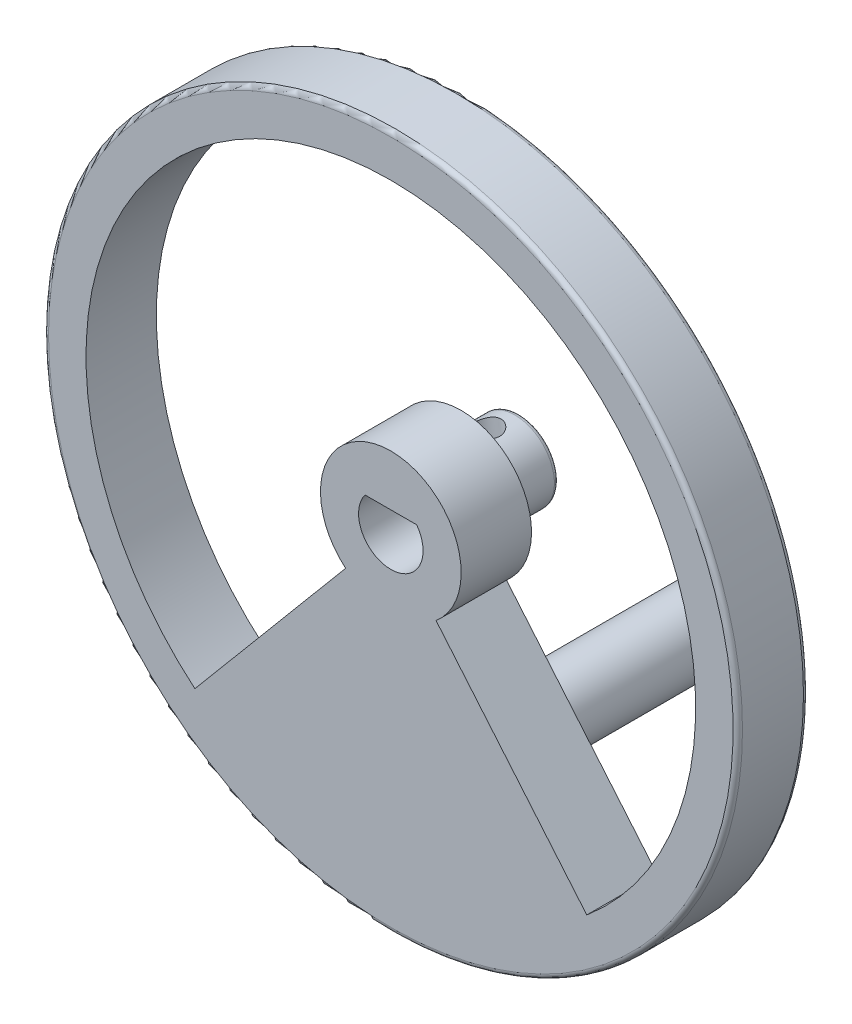
ISO-10303-21;
HEADER;
FILE_DESCRIPTION(('STEP AP214'),'2;1');
FILE_NAME('part.step','',(''),(''),'','','');
FILE_SCHEMA(('AUTOMOTIVE_DESIGN { 1 0 10303 214 1 1 1 1 }'));
ENDSEC;
DATA;
#1=APPLICATION_CONTEXT('core data for automotive mechanical design processes');
#2=APPLICATION_PROTOCOL_DEFINITION('international standard','automotive_design',2000,#1);
#3=PRODUCT_CONTEXT('',#1,'mechanical');
#4=PRODUCT('Part','Part','',(#3));
#5=PRODUCT_RELATED_PRODUCT_CATEGORY('part','',(#4));
#6=PRODUCT_DEFINITION_FORMATION('','',#4);
#7=PRODUCT_DEFINITION_CONTEXT('part definition',#1,'design');
#8=PRODUCT_DEFINITION('design','',#6,#7);
#9=PRODUCT_DEFINITION_SHAPE('','',#8);
#10=(LENGTH_UNIT() NAMED_UNIT(*) SI_UNIT(.MILLI.,.METRE.));
#11=(NAMED_UNIT(*) PLANE_ANGLE_UNIT() SI_UNIT($,.RADIAN.));
#12=(NAMED_UNIT(*) SI_UNIT($,.STERADIAN.) SOLID_ANGLE_UNIT());
#13=UNCERTAINTY_MEASURE_WITH_UNIT(LENGTH_MEASURE(1.E-05),#10,'distance_accuracy_value','');
#14=(GEOMETRIC_REPRESENTATION_CONTEXT(3) GLOBAL_UNCERTAINTY_ASSIGNED_CONTEXT((#13)) GLOBAL_UNIT_ASSIGNED_CONTEXT((#10,
#11,#12)) REPRESENTATION_CONTEXT('',''));
#15=CARTESIAN_POINT('',(0.,0.,0.));
#16=DIRECTION('',(0.,0.,1.));
#17=DIRECTION('',(1.,0.,0.));
#18=AXIS2_PLACEMENT_3D('',#15,#16,#17);
#19=CARTESIAN_POINT('',(0.,-2.,-1.));
#20=DIRECTION('',(0.,0.,-1.));
#21=DIRECTION('',(-1.,0.,0.));
#22=AXIS2_PLACEMENT_3D('',#19,#20,#21);
#23=PLANE('',#22);
#24=CARTESIAN_POINT('',(0.,-2.,-1.));
#25=DIRECTION('',(0.,0.,1.));
#26=DIRECTION('',(-1.,0.,0.));
#27=AXIS2_PLACEMENT_3D('',#24,#25,#26);
#28=CIRCLE('',#27,3.);
#29=CARTESIAN_POINT('',(1.92836282905961,-4.29813332935694,-1.));
#30=VERTEX_POINT('',#29);
#31=CARTESIAN_POINT('',(-1.92836282905961,-4.29813332935694,-1.));
#32=VERTEX_POINT('',#31);
#33=EDGE_CURVE('E59',#30,#32,#28,.T.);
#34=ORIENTED_EDGE('',*,*,#33,.F.);
#35=DIRECTION('',(-0.642787609686538,0.766044443118979,0.));
#36=VECTOR('',#35,1.);
#37=CARTESIAN_POINT('',(1.92836282905961,-4.29813332935694,-1.));
#38=LINE('',#37,#36);
#39=CARTESIAN_POINT('',(8.35623892592499,-11.9585777605467,-1.));
#40=VERTEX_POINT('',#39);
#41=EDGE_CURVE('E321',#40,#30,#38,.T.);
#42=ORIENTED_EDGE('',*,*,#41,.F.);
#43=CARTESIAN_POINT('',(0.,-2.,-1.));
#44=DIRECTION('',(0.,0.,-1.));
#45=DIRECTION('',(-1.,0.,0.));
#46=AXIS2_PLACEMENT_3D('',#43,#44,#45);
#47=CIRCLE('',#46,13.);
#48=CARTESIAN_POINT('',(-8.35623892592499,-11.9585777605467,-1.));
#49=VERTEX_POINT('',#48);
#50=EDGE_CURVE('E328',#49,#40,#47,.T.);
#51=ORIENTED_EDGE('',*,*,#50,.F.);
#52=DIRECTION('',(-0.642787609686538,-0.766044443118979,0.));
#53=VECTOR('',#52,1.);
#54=CARTESIAN_POINT('',(-1.92836282905961,-4.29813332935694,-1.));
#55=LINE('',#54,#53);
#56=EDGE_CURVE('E331',#32,#49,#55,.T.);
#57=ORIENTED_EDGE('',*,*,#56,.F.);
#58=EDGE_LOOP('',(#34,#42,#51,#57));
#59=FACE_BOUND('',#58,.T.);
#60=CARTESIAN_POINT('',(0.,-2.,-1.));
#61=DIRECTION('',(0.,0.,-1.));
#62=DIRECTION('',(-1.,0.,0.));
#63=AXIS2_PLACEMENT_3D('',#60,#61,#62);
#64=CIRCLE('',#63,14.5982201502927);
#65=CARTESIAN_POINT('',(-14.5982201502927,-2.,-1.));
#66=VERTEX_POINT('',#65);
#67=EDGE_CURVE('E274',#66,#66,#64,.T.);
#68=ORIENTED_EDGE('',*,*,#67,.T.);
#69=EDGE_LOOP('',(#68));
#70=FACE_BOUND('',#69,.T.);
#71=CARTESIAN_POINT('',(0.,-2.,-1.));
#72=DIRECTION('',(0.,0.,-1.));
#73=DIRECTION('',(-1.,0.,0.));
#74=AXIS2_PLACEMENT_3D('',#71,#72,#73);
#75=CIRCLE('',#74,1.675);
#76=CARTESIAN_POINT('',(-1.675,-2.,-1.));
#77=VERTEX_POINT('',#76);
#78=EDGE_CURVE('E268',#77,#77,#75,.T.);
#79=ORIENTED_EDGE('',*,*,#78,.F.);
#80=EDGE_LOOP('',(#79));
#81=FACE_BOUND('',#80,.T.);
#82=CARTESIAN_POINT('',(0.,-12.,-1.));
#83=DIRECTION('',(0.,0.,-1.));
#84=DIRECTION('',(-1.,0.,0.));
#85=AXIS2_PLACEMENT_3D('',#82,#83,#84);
#86=CIRCLE('',#85,2.);
#87=CARTESIAN_POINT('',(-2.,-12.,-1.));
#88=VERTEX_POINT('',#87);
#89=EDGE_CURVE('E253',#88,#88,#86,.T.);
#90=ORIENTED_EDGE('',*,*,#89,.F.);
#91=EDGE_LOOP('',(#90));
#92=FACE_BOUND('',#91,.T.);
#93=ADVANCED_FACE('F37',(#59,#70,#81,#92),#23,.T.);
#94=CARTESIAN_POINT('',(0.,-2.,-1.));
#95=DIRECTION('',(0.,0.,1.));
#96=DIRECTION('',(1.,0.,0.));
#97=AXIS2_PLACEMENT_3D('',#94,#95,#96);
#98=CYLINDRICAL_SURFACE('',#97,14.7982201502927);
#99=CARTESIAN_POINT('',(0.,-2.,1.8));
#100=DIRECTION('',(0.,0.,-1.));
#101=DIRECTION('',(-1.,0.,0.));
#102=AXIS2_PLACEMENT_3D('',#99,#100,#101);
#103=CIRCLE('',#102,14.7982201502927);
#104=CARTESIAN_POINT('',(-14.7982201502927,-2.,1.8));
#105=VERTEX_POINT('',#104);
#106=EDGE_CURVE('E281',#105,#105,#103,.T.);
#107=ORIENTED_EDGE('',*,*,#106,.T.);
#108=EDGE_LOOP('',(#107));
#109=FACE_BOUND('',#108,.T.);
#110=CARTESIAN_POINT('',(0.,-2.,-0.8));
#111=DIRECTION('',(0.,0.,-1.));
#112=DIRECTION('',(-1.,0.,0.));
#113=AXIS2_PLACEMENT_3D('',#110,#111,#112);
#114=CIRCLE('',#113,14.7982201502927);
#115=CARTESIAN_POINT('',(-14.7982201502927,-2.,-0.8));
#116=VERTEX_POINT('',#115);
#117=EDGE_CURVE('E278',#116,#116,#114,.F.);
#118=ORIENTED_EDGE('',*,*,#117,.T.);
#119=EDGE_LOOP('',(#118));
#120=FACE_BOUND('',#119,.T.);
#121=ADVANCED_FACE('F207',(#109,#120),#98,.T.);
#122=CARTESIAN_POINT('',(0.,-2.,2.));
#123=DIRECTION('',(0.,0.,-1.));
#124=DIRECTION('',(-1.,0.,0.));
#125=AXIS2_PLACEMENT_3D('',#122,#123,#124);
#126=PLANE('',#125);
#127=DIRECTION('',(0.642787609686538,-0.766044443118979,0.));
#128=VECTOR('',#127,1.);
#129=CARTESIAN_POINT('',(1.92836282905961,-4.29813332935694,2.));
#130=LINE('',#129,#128);
#131=CARTESIAN_POINT('',(1.92836282905961,-4.29813332935694,2.));
#132=VERTEX_POINT('',#131);
#133=CARTESIAN_POINT('',(8.35623892592499,-11.9585777605467,2.));
#134=VERTEX_POINT('',#133);
#135=EDGE_CURVE('E338',#132,#134,#130,.T.);
#136=ORIENTED_EDGE('',*,*,#135,.F.);
#137=CARTESIAN_POINT('',(0.,-2.,2.));
#138=DIRECTION('',(0.,0.,-1.));
#139=DIRECTION('',(-1.,0.,0.));
#140=AXIS2_PLACEMENT_3D('',#137,#138,#139);
#141=CIRCLE('',#140,3.);
#142=CARTESIAN_POINT('',(-1.92836282905961,-4.29813332935694,2.));
#143=VERTEX_POINT('',#142);
#144=EDGE_CURVE('E335',#143,#132,#141,.T.);
#145=ORIENTED_EDGE('',*,*,#144,.F.);
#146=DIRECTION('',(0.642787609686538,0.766044443118979,0.));
#147=VECTOR('',#146,1.);
#148=CARTESIAN_POINT('',(-1.92836282905961,-4.29813332935694,2.));
#149=LINE('',#148,#147);
#150=CARTESIAN_POINT('',(-8.35623892592499,-11.9585777605467,2.));
#151=VERTEX_POINT('',#150);
#152=EDGE_CURVE('E314',#151,#143,#149,.T.);
#153=ORIENTED_EDGE('',*,*,#152,.F.);
#154=CARTESIAN_POINT('',(0.,-2.,2.));
#155=DIRECTION('',(0.,0.,-1.));
#156=DIRECTION('',(-1.,0.,0.));
#157=AXIS2_PLACEMENT_3D('',#154,#155,#156);
#158=CIRCLE('',#157,13.);
#159=EDGE_CURVE('E341',#134,#151,#158,.F.);
#160=ORIENTED_EDGE('',*,*,#159,.F.);
#161=EDGE_LOOP('',(#136,#145,#153,#160));
#162=FACE_BOUND('',#161,.T.);
#163=DIRECTION('',(1.,0.,0.));
#164=VECTOR('',#163,1.);
#165=CARTESIAN_POINT('',(0.,-1.175,2.));
#166=LINE('',#165,#164);
#167=CARTESIAN_POINT('',(-1.1,-1.175,2.));
#168=VERTEX_POINT('',#167);
#169=CARTESIAN_POINT('',(1.1,-1.175,2.));
#170=VERTEX_POINT('',#169);
#171=EDGE_CURVE('E125',#168,#170,#166,.T.);
#172=ORIENTED_EDGE('',*,*,#171,.T.);
#173=CARTESIAN_POINT('',(0.,-2.,2.));
#174=DIRECTION('',(0.,0.,-1.));
#175=DIRECTION('',(-1.,0.,0.));
#176=AXIS2_PLACEMENT_3D('',#173,#174,#175);
#177=CIRCLE('',#176,1.375);
#178=EDGE_CURVE('E129',#170,#168,#177,.T.);
#179=ORIENTED_EDGE('',*,*,#178,.T.);
#180=EDGE_LOOP('',(#172,#179));
#181=FACE_BOUND('',#180,.T.);
#182=CARTESIAN_POINT('',(0.,-2.,2.));
#183=DIRECTION('',(0.,0.,-1.));
#184=DIRECTION('',(-1.,0.,0.));
#185=AXIS2_PLACEMENT_3D('',#182,#183,#184);
#186=CIRCLE('',#185,14.5982201502927);
#187=CARTESIAN_POINT('',(-14.5982201502927,-2.,2.));
#188=VERTEX_POINT('',#187);
#189=EDGE_CURVE('E132',#188,#188,#186,.F.);
#190=ORIENTED_EDGE('',*,*,#189,.T.);
#191=EDGE_LOOP('',(#190));
#192=FACE_BOUND('',#191,.T.);
#193=ADVANCED_FACE('F209',(#162,#181,#192),#126,.F.);
#194=CARTESIAN_POINT('',(0.,-2.,-0.8));
#195=DIRECTION('',(0.,0.,-1.));
#196=DIRECTION('',(-1.,0.,0.));
#197=AXIS2_PLACEMENT_3D('',#194,#195,#196);
#198=TOROIDAL_SURFACE('',#197,14.5982201502927,0.2);
#199=ORIENTED_EDGE('',*,*,#117,.F.);
#200=EDGE_LOOP('',(#199));
#201=FACE_BOUND('',#200,.T.);
#202=ORIENTED_EDGE('',*,*,#67,.F.);
#203=EDGE_LOOP('',(#202));
#204=FACE_BOUND('',#203,.T.);
#205=ADVANCED_FACE('F212',(#201,#204),#198,.T.);
#206=CARTESIAN_POINT('',(0.,-2.,1.8));
#207=DIRECTION('',(0.,0.,-1.));
#208=DIRECTION('',(-1.,0.,0.));
#209=AXIS2_PLACEMENT_3D('',#206,#207,#208);
#210=TOROIDAL_SURFACE('',#209,14.5982201502927,0.2);
#211=ORIENTED_EDGE('',*,*,#189,.F.);
#212=EDGE_LOOP('',(#211));
#213=FACE_BOUND('',#212,.T.);
#214=ORIENTED_EDGE('',*,*,#106,.F.);
#215=EDGE_LOOP('',(#214));
#216=FACE_BOUND('',#215,.T.);
#217=ADVANCED_FACE('F195',(#213,#216),#210,.T.);
#218=CARTESIAN_POINT('',(0.,-2.,2.5));
#219=DIRECTION('',(0.,0.,-1.));
#220=DIRECTION('',(-1.,0.,0.));
#221=AXIS2_PLACEMENT_3D('',#218,#219,#220);
#222=CYLINDRICAL_SURFACE('',#221,1.375);
#223=CARTESIAN_POINT('',(0.786367633467589,-3.12794102019325,-2.24441223535997));
#224=CARTESIAN_POINT('',(0.786364048983087,-3.12794593504006,-2.21140102057159));
#225=CARTESIAN_POINT('',(0.783945436582444,-3.12964194847358,-2.17835044672341));
#226=CARTESIAN_POINT('',(0.774357814028464,-3.13623337166596,-2.11322294213821));
#227=CARTESIAN_POINT('',(0.76717710388292,-3.14113666097013,-2.08114861344341));
#228=CARTESIAN_POINT('',(0.748372079447081,-3.15355518873635,-2.0190424671743));
#229=CARTESIAN_POINT('',(0.736768226295408,-3.16105838588867,-1.98900198368062));
#230=CARTESIAN_POINT('',(0.70944186422138,-3.17795345172177,-1.93145482342112));
#231=CARTESIAN_POINT('',(0.693719791512772,-3.18734512034573,-1.90394787871237));
#232=CARTESIAN_POINT('',(0.657275376610338,-3.20792392841384,-1.85018862739198));
#233=CARTESIAN_POINT('',(0.636286992907342,-3.21918950011451,-1.82414660859055));
#234=CARTESIAN_POINT('',(0.590332408826737,-3.24209163846734,-1.77601810890594));
#235=CARTESIAN_POINT('',(0.565364503803998,-3.25372836238773,-1.75393333177508));
#236=CARTESIAN_POINT('',(0.510431947533978,-3.27711423461864,-1.71319944906709));
#237=CARTESIAN_POINT('',(0.480271757449288,-3.28883624716607,-1.69479656091457));
#238=CARTESIAN_POINT('',(0.416663319550979,-3.3107805458754,-1.66364098832396));
#239=CARTESIAN_POINT('',(0.383216806914694,-3.3210036164469,-1.65088534152562));
#240=CARTESIAN_POINT('',(0.316076979882071,-3.3386002806524,-1.63217865163233));
#241=CARTESIAN_POINT('',(0.282521230173143,-3.3461089276737,-1.62586236097416));
#242=CARTESIAN_POINT('',(0.214374605469172,-3.35862664731924,-1.61902361525765));
#243=CARTESIAN_POINT('',(0.179784244843486,-3.36363694083476,-1.61849832760705));
#244=CARTESIAN_POINT('',(0.113227694157038,-3.37070940724967,-1.62308674207041));
#245=CARTESIAN_POINT('',(0.0812523011027979,-3.37295826788385,-1.62779616918021));
#246=CARTESIAN_POINT('',(0.018310627768156,-3.37523881808645,-1.64201420195062));
#247=CARTESIAN_POINT('',(-0.012655577504552,-3.37527034322577,-1.65152316347366));
#248=CARTESIAN_POINT('',(-0.0732350264513509,-3.37338806397897,-1.67516724330639));
#249=CARTESIAN_POINT('',(-0.102820708830124,-3.3714448175869,-1.68937018296095));
#250=CARTESIAN_POINT('',(-0.159458774086087,-3.36601924131324,-1.72192356878679));
#251=CARTESIAN_POINT('',(-0.186510223942216,-3.36253634726182,-1.74027553407129));
#252=CARTESIAN_POINT('',(-0.239601823380074,-3.35425090232414,-1.78233711318197));
#253=CARTESIAN_POINT('',(-0.265379681783792,-3.34936390762842,-1.80636155892853));
#254=CARTESIAN_POINT('',(-0.312699238263193,-3.339190492857,-1.8582207968663));
#255=CARTESIAN_POINT('',(-0.33423863683942,-3.33390385810473,-1.88605764359388));
#256=CARTESIAN_POINT('',(-0.373312387879268,-3.32351451729098,-1.94631721018026));
#257=CARTESIAN_POINT('',(-0.390621647025391,-3.3184309322155,-1.97889036035468));
#258=CARTESIAN_POINT('',(-0.419162089461484,-3.30963875825655,-2.04676740043679));
#259=CARTESIAN_POINT('',(-0.430398557271841,-3.30592897478402,-2.08206888547754));
#260=CARTESIAN_POINT('',(-0.445592301987802,-3.30082000972164,-2.15167634057748));
#261=CARTESIAN_POINT('',(-0.450018999163597,-3.29927257667692,-2.18586839080743));
#262=CARTESIAN_POINT('',(-0.452838633122868,-3.29829322517905,-2.25452388396528));
#263=CARTESIAN_POINT('',(-0.451234420203376,-3.29886030737379,-2.28898719100974));
#264=CARTESIAN_POINT('',(-0.442480578124698,-3.30186536831301,-2.35419636883703));
#265=CARTESIAN_POINT('',(-0.435799255199598,-3.30414517533773,-2.38501439925011));
#266=CARTESIAN_POINT('',(-0.417769073034797,-3.31003177155006,-2.44511603407312));
#267=CARTESIAN_POINT('',(-0.406418972601573,-3.3136389135825,-2.47439922811138));
#268=CARTESIAN_POINT('',(-0.378867650253449,-3.32185444362862,-2.53209485345969));
#269=CARTESIAN_POINT('',(-0.362469610782125,-3.32650084820148,-2.56040742157051));
#270=CARTESIAN_POINT('',(-0.325552833231649,-3.33604025312189,-2.61416203563516));
#271=CARTESIAN_POINT('',(-0.30503210918443,-3.34093337146152,-2.63960268887747));
#272=CARTESIAN_POINT('',(-0.258121274868487,-3.35078788133624,-2.68955288832858));
#273=CARTESIAN_POINT('',(-0.231348976112809,-3.35570693223025,-2.71371335219694));
#274=CARTESIAN_POINT('',(-0.174084087071994,-3.36424233774362,-2.75743679199781));
#275=CARTESIAN_POINT('',(-0.14359086246143,-3.36785846983119,-2.77699898237089));
#276=CARTESIAN_POINT('',(-0.0792994841685831,-3.3730939174306,-2.81111097702103));
#277=CARTESIAN_POINT('',(-0.0454682094065791,-3.37469046969604,-2.82560233219393));
#278=CARTESIAN_POINT('',(0.0241751109391638,-3.37522709439017,-2.84865246353133));
#279=CARTESIAN_POINT('',(0.0599857091759198,-3.37416908343509,-2.85721551428338));
#280=CARTESIAN_POINT('',(0.129436625891985,-3.36930088130951,-2.8675560303764));
#281=CARTESIAN_POINT('',(0.163020361134217,-3.36571846889358,-2.86982308242178));
#282=CARTESIAN_POINT('',(0.229750056423248,-3.3560881736866,-2.86887929936736));
#283=CARTESIAN_POINT('',(0.262896119909136,-3.35004088461393,-2.86566978282371));
#284=CARTESIAN_POINT('',(0.32617864004835,-3.33612613693495,-2.85421084652718));
#285=CARTESIAN_POINT('',(0.35638320364722,-3.3283597763815,-2.84621028447519));
#286=CARTESIAN_POINT('',(0.414755662020754,-3.31130778794842,-2.82569471420598));
#287=CARTESIAN_POINT('',(0.442923210331359,-3.30202190249389,-2.81317894018042));
#288=CARTESIAN_POINT('',(0.4978947398855,-3.28203756650736,-2.78336296186002));
#289=CARTESIAN_POINT('',(0.524577453946075,-3.27129393741467,-2.76587013309438));
#290=CARTESIAN_POINT('',(0.574655741339685,-3.24945721721962,-2.72685685570672));
#291=CARTESIAN_POINT('',(0.598049870220499,-3.23836397515862,-2.7053346468695));
#292=CARTESIAN_POINT('',(0.642980372056273,-3.2156832807318,-2.65679081001921));
#293=CARTESIAN_POINT('',(0.664203237786427,-3.20413079701503,-2.6294616201762));
#294=CARTESIAN_POINT('',(0.701977805832014,-3.18250896752245,-2.57118310198935));
#295=CARTESIAN_POINT('',(0.718526429438061,-3.17244060134435,-2.54023140655791));
#296=CARTESIAN_POINT('',(0.746619176199128,-3.1547569384408,-2.47515537819804));
#297=CARTESIAN_POINT('',(0.758122446660918,-3.14716179038123,-2.44100776834039));
#298=CARTESIAN_POINT('',(0.775457991528625,-3.13551887277513,-2.37079666481389));
#299=CARTESIAN_POINT('',(0.781309302359871,-3.13145919993636,-2.33474003690092));
#300=CARTESIAN_POINT('',(0.785651647147896,-3.12843975629895,-2.28044729614991));
#301=CARTESIAN_POINT('',(0.786369590517234,-3.12793833679506,-2.26243563206469));
#302=CARTESIAN_POINT('',(0.786367633467589,-3.12794102019325,-2.24441223535997));
#303=B_SPLINE_CURVE_WITH_KNOTS('',3,(#223,#224,#225,#226,#227,#228,#229,#230,#231,#232,#233,
#234,#235,#236,#237,#238,#239,#240,#241,#242,#243,#244,#245,#246,#247,#248,#249,#250,#251,#252,
#253,#254,#255,#256,#257,#258,#259,#260,#261,#262,#263,#264,#265,#266,#267,#268,#269,#270,#271,
#272,#273,#274,#275,#276,#277,#278,#279,#280,#281,#282,#283,#284,#285,#286,#287,#288,#289,#290,
#291,#292,#293,#294,#295,#296,#297,#298,#299,#300,#301,#302),.UNSPECIFIED.,.T.,.F.,(4,2,2,2,2,2,
2,2,2,2,2,2,2,2,2,2,2,2,2,2,2,2,2,2,2,2,2,2,2,2,2,2,2,2,2,2,2,2,2,4),(0.,0.0989747450725665,
0.198193566447279,0.296958872011047,0.395713720294979,0.501139910526477,0.606611382494077,
0.717710962135357,0.828752193275474,0.933069986195844,1.03733675118731,1.13407773887728,
1.2308259005006,1.32903795892013,1.42728603484506,1.53354473060067,1.63986091709601,
1.75098365581288,1.86200953960009,1.96497148926761,2.06788478371842,2.16230966703875,
2.25675966943516,2.35549698537778,2.45428197932382,2.56297113028489,2.67167883600017,
2.7816012057238,2.89144423344464,2.99246849997866,3.09346844701904,3.18962894044185,
3.28580575096272,3.38638088221853,3.48700005218646,3.59593817108159,3.70494787609602,
3.81482464284523,3.9243300285465,3.9783680609433),.UNSPECIFIED.);
#304=CARTESIAN_POINT('',(0.786367633467589,-3.12794102019325,-2.24441223535997));
#305=VERTEX_POINT('',#304);
#306=EDGE_CURVE('E183',#305,#305,#303,.T.);
#307=ORIENTED_EDGE('',*,*,#306,.T.);
#308=EDGE_LOOP('',(#307));
#309=FACE_BOUND('',#308,.T.);
#310=DIRECTION('',(0.,0.,-1.));
#311=VECTOR('',#310,1.);
#312=CARTESIAN_POINT('',(1.1,-1.175,2.5));
#313=LINE('',#312,#311);
#314=CARTESIAN_POINT('',(1.1,-1.175,-3.));
#315=VERTEX_POINT('',#314);
#316=EDGE_CURVE('E272',#170,#315,#313,.T.);
#317=ORIENTED_EDGE('',*,*,#316,.T.);
#318=CARTESIAN_POINT('',(0.,-2.,-3.));
#319=DIRECTION('',(0.,0.,1.));
#320=DIRECTION('',(1.,0.,0.));
#321=AXIS2_PLACEMENT_3D('',#318,#319,#320);
#322=CIRCLE('',#321,1.375);
#323=CARTESIAN_POINT('',(-1.1,-1.175,-3.));
#324=VERTEX_POINT('',#323);
#325=EDGE_CURVE('E255',#324,#315,#322,.T.);
#326=ORIENTED_EDGE('',*,*,#325,.F.);
#327=DIRECTION('',(0.,0.,-1.));
#328=VECTOR('',#327,1.);
#329=CARTESIAN_POINT('',(-1.1,-1.175,2.5));
#330=LINE('',#329,#328);
#331=EDGE_CURVE('E271',#168,#324,#330,.T.);
#332=ORIENTED_EDGE('',*,*,#331,.F.);
#333=ORIENTED_EDGE('',*,*,#178,.F.);
#334=EDGE_LOOP('',(#317,#326,#332,#333));
#335=FACE_BOUND('',#334,.T.);
#336=ADVANCED_FACE('F190',(#309,#335),#222,.F.);
#337=CARTESIAN_POINT('',(1.1,-1.175,2.5));
#338=DIRECTION('',(0.,1.,0.));
#339=DIRECTION('',(0.,0.,1.));
#340=AXIS2_PLACEMENT_3D('',#337,#338,#339);
#341=PLANE('',#340);
#342=CARTESIAN_POINT('',(-0.113706252197006,-1.175,-2.24441223535997));
#343=DIRECTION('',(0.,1.,0.));
#344=DIRECTION('',(1.,0.,0.));
#345=AXIS2_PLACEMENT_3D('',#342,#343,#344);
#346=ELLIPSE('',#345,0.630908304854931,0.625);
#347=CARTESIAN_POINT('',(0.517202052657926,-1.175,-2.24441223535997));
#348=VERTEX_POINT('',#347);
#349=EDGE_CURVE('E262',#348,#348,#346,.T.);
#350=ORIENTED_EDGE('',*,*,#349,.T.);
#351=EDGE_LOOP('',(#350));
#352=FACE_BOUND('',#351,.T.);
#353=ORIENTED_EDGE('',*,*,#331,.T.);
#354=DIRECTION('',(-1.,0.,0.));
#355=VECTOR('',#354,1.);
#356=CARTESIAN_POINT('',(1.1,-1.175,-3.));
#357=LINE('',#356,#355);
#358=EDGE_CURVE('E259',#315,#324,#357,.T.);
#359=ORIENTED_EDGE('',*,*,#358,.F.);
#360=ORIENTED_EDGE('',*,*,#316,.F.);
#361=ORIENTED_EDGE('',*,*,#171,.F.);
#362=EDGE_LOOP('',(#353,#359,#360,#361));
#363=FACE_BOUND('',#362,.T.);
#364=ADVANCED_FACE('F194',(#352,#363),#341,.F.);
#365=CARTESIAN_POINT('',(0.,-2.,-3.5));
#366=DIRECTION('',(0.,0.,1.));
#367=DIRECTION('',(1.,0.,0.));
#368=AXIS2_PLACEMENT_3D('',#365,#366,#367);
#369=CYLINDRICAL_SURFACE('',#368,1.675);
#370=CARTESIAN_POINT('',(0.406967859314376,-0.375191653921893,-2.24441223535997));
#371=CARTESIAN_POINT('',(0.406969207307909,-0.375192597744715,-2.21064535076085));
#372=CARTESIAN_POINT('',(0.404096082676089,-0.374464427939584,-2.17688646632121));
#373=CARTESIAN_POINT('',(0.392745119754163,-0.371684914289366,-2.11038569466162));
#374=CARTESIAN_POINT('',(0.384267405046501,-0.369633599619939,-2.07764378503382));
#375=CARTESIAN_POINT('',(0.362098776713465,-0.364568254392525,-2.01415558061182));
#376=CARTESIAN_POINT('',(0.348420243429246,-0.361556512817445,-1.98340474802216));
#377=CARTESIAN_POINT('',(0.316336840595703,-0.355061386506752,-1.92453198602397));
#378=CARTESIAN_POINT('',(0.297930566621054,-0.351577861768579,-1.89641084118383));
#379=CARTESIAN_POINT('',(0.256010900987393,-0.344538117162373,-1.84221211388915));
#380=CARTESIAN_POINT('',(0.232305877574624,-0.340985616567638,-1.81628222660658));
#381=CARTESIAN_POINT('',(0.180965170432167,-0.334603602461325,-1.76854333912317));
#382=CARTESIAN_POINT('',(0.153328661037801,-0.331774241168635,-1.74673520679199));
#383=CARTESIAN_POINT('',(0.093840033893802,-0.327356334157859,-1.70714937209969));
#384=CARTESIAN_POINT('',(0.0618773731170459,-0.325812734241053,-1.68953194378299));
#385=CARTESIAN_POINT('',(-0.00458121377602966,-0.324677278918746,-1.65989949334769));
#386=CARTESIAN_POINT('',(-0.0390762659906708,-0.325084753306493,-1.6478825489826));
#387=CARTESIAN_POINT('',(-0.108011073817463,-0.328145520991618,-1.63030938572636));
#388=CARTESIAN_POINT('',(-0.142390161589969,-0.330702068801024,-1.62449895149043));
#389=CARTESIAN_POINT('',(-0.21139810625214,-0.338031826174017,-1.61868949676803));
#390=CARTESIAN_POINT('',(-0.246026879135975,-0.342804321580077,-1.61868860527533));
#391=CARTESIAN_POINT('',(-0.312754811816136,-0.354126538352377,-1.62434959765028));
#392=CARTESIAN_POINT('',(-0.344894787670214,-0.360577739499184,-1.6297340647095));
#393=CARTESIAN_POINT('',(-0.407542997758669,-0.375017662530985,-1.64554664226605));
#394=CARTESIAN_POINT('',(-0.438051116410319,-0.383006493140863,-1.65597510950062));
#395=CARTESIAN_POINT('',(-0.497130448520693,-0.400172768454987,-1.68171002792039));
#396=CARTESIAN_POINT('',(-0.525667155581592,-0.4093657707657,-1.69708502854208));
#397=CARTESIAN_POINT('',(-0.57971710415335,-0.428257648372406,-1.73221610577845));
#398=CARTESIAN_POINT('',(-0.605229371654693,-0.437956685194574,-1.75197358790542));
#399=CARTESIAN_POINT('',(-0.654131303139248,-0.457769978109707,-1.79664831197424));
#400=CARTESIAN_POINT('',(-0.677312111151405,-0.467875700296297,-1.82179831162058));
#401=CARTESIAN_POINT('',(-0.719278958234183,-0.487122922752997,-1.87586563656178));
#402=CARTESIAN_POINT('',(-0.738063916054358,-0.496264185491325,-1.90478388601828));
#403=CARTESIAN_POINT('',(-0.771152316502785,-0.512955552164282,-1.96638010413792));
#404=CARTESIAN_POINT('',(-0.785349214727104,-0.520466654569706,-1.99912625385156));
#405=CARTESIAN_POINT('',(-0.808245264785493,-0.532847641540345,-2.06695414645238));
#406=CARTESIAN_POINT('',(-0.816947439389799,-0.537718978090246,-2.10203459342814));
#407=CARTESIAN_POINT('',(-0.828215610661212,-0.544072901081907,-2.17148089142389));
#408=CARTESIAN_POINT('',(-0.831091347793545,-0.545726347862188,-2.20578078911322));
#409=CARTESIAN_POINT('',(-0.831533208039125,-0.545978690110327,-2.27442151777146));
#410=CARTESIAN_POINT('',(-0.829100639128958,-0.544578338040019,-2.30876233657346));
#411=CARTESIAN_POINT('',(-0.819261648727444,-0.539019427714204,-2.37482573983554));
#412=CARTESIAN_POINT('',(-0.812093394582524,-0.534993055685133,-2.40659563578782));
#413=CARTESIAN_POINT('',(-0.793251865992765,-0.524706518286998,-2.46838661163418));
#414=CARTESIAN_POINT('',(-0.781577674119651,-0.518445898034982,-2.49840733395541));
#415=CARTESIAN_POINT('',(-0.75351565804851,-0.503973083870497,-2.55709092413302));
#416=CARTESIAN_POINT('',(-0.736968487366816,-0.49569689538778,-2.58566159148389));
#417=CARTESIAN_POINT('',(-0.699728350616668,-0.47801789080903,-2.63957447004318));
#418=CARTESIAN_POINT('',(-0.67903388021485,-0.468614666406678,-2.66491550430749));
#419=CARTESIAN_POINT('',(-0.632478849220534,-0.448783092838536,-2.71329641670754));
#420=CARTESIAN_POINT('',(-0.606375856365972,-0.438327427650612,-2.73609265695329));
#421=CARTESIAN_POINT('',(-0.550483326563604,-0.417761499993663,-2.7768112813669));
#422=CARTESIAN_POINT('',(-0.520693786302514,-0.407651237835079,-2.79473366115434));
#423=CARTESIAN_POINT('',(-0.458231655222132,-0.388568962679819,-2.82507490230053));
#424=CARTESIAN_POINT('',(-0.42557001274086,-0.379592920042534,-2.83751366182014));
#425=CARTESIAN_POINT('',(-0.358171682641016,-0.363376383528555,-2.85649666067737));
#426=CARTESIAN_POINT('',(-0.323435967289267,-0.356135084309394,-2.86304363913951));
#427=CARTESIAN_POINT('',(-0.255018286220014,-0.344183897732636,-2.86976407108792));
#428=CARTESIAN_POINT('',(-0.221391353887005,-0.339351947669067,-2.87028384012263));
#429=CARTESIAN_POINT('',(-0.154270979837331,-0.331777701726146,-2.86582420361321));
#430=CARTESIAN_POINT('',(-0.120777522762902,-0.3290351581022,-2.86084545021009));
#431=CARTESIAN_POINT('',(-0.0557123610827356,-0.325617046137224,-2.84577278343076));
#432=CARTESIAN_POINT('',(-0.024113838820199,-0.324893524792107,-2.83580429502215));
#433=CARTESIAN_POINT('',(0.0371802753043512,-0.325131957586809,-2.81115956423622));
#434=CARTESIAN_POINT('',(0.0668755058334563,-0.32609423079182,-2.79648243109756));
#435=CARTESIAN_POINT('',(0.124835983493548,-0.329395615899806,-2.76213794599611));
#436=CARTESIAN_POINT('',(0.152989399646297,-0.331790655632456,-2.74228748106794));
#437=CARTESIAN_POINT('',(0.205770320493086,-0.337474971273201,-2.69844953701225));
#438=CARTESIAN_POINT('',(0.230396566041545,-0.340764565314701,-2.67446058721296));
#439=CARTESIAN_POINT('',(0.276677578667317,-0.347834326730363,-2.62153942294099));
#440=CARTESIAN_POINT('',(0.298110529820529,-0.351631127833222,-2.59241471133732));
#441=CARTESIAN_POINT('',(0.335698231974947,-0.358872489138272,-2.53088633219596));
#442=CARTESIAN_POINT('',(0.351852535972503,-0.362317019492696,-2.49848238727208));
#443=CARTESIAN_POINT('',(0.378770661854009,-0.368326744695414,-2.42991107143802));
#444=CARTESIAN_POINT('',(0.389295830084281,-0.370851740806428,-2.39364550892437));
#445=CARTESIAN_POINT('',(0.403391447149037,-0.374283150235892,-2.31972012091151));
#446=CARTESIAN_POINT('',(0.40696635634575,-0.375190601590367,-2.28206120542884));
#447=CARTESIAN_POINT('',(0.406967859314376,-0.375191653921893,-2.24441223535997));
#448=B_SPLINE_CURVE_WITH_KNOTS('',3,(#370,#371,#372,#373,#374,#375,#376,#377,#378,#379,#380,
#381,#382,#383,#384,#385,#386,#387,#388,#389,#390,#391,#392,#393,#394,#395,#396,#397,#398,#399,
#400,#401,#402,#403,#404,#405,#406,#407,#408,#409,#410,#411,#412,#413,#414,#415,#416,#417,#418,
#419,#420,#421,#422,#423,#424,#425,#426,#427,#428,#429,#430,#431,#432,#433,#434,#435,#436,#437,
#438,#439,#440,#441,#442,#443,#444,#445,#446,#447),.UNSPECIFIED.,.T.,.F.,(4,2,2,2,2,2,2,2,2,2,2,
2,2,2,2,2,2,2,2,2,2,2,2,2,2,2,2,2,2,2,2,2,2,2,2,2,2,2,4),(0.,0.101160494498562,
0.202318758460374,0.303237711727192,0.404186678777141,0.509651593547259,0.615138690149623,
0.724174587887556,0.83317303377083,0.937512176298151,1.04181771563078,1.14101333427022,
1.24021596955258,1.34085728705548,1.44153092817613,1.54804208924161,1.65457942146098,
1.76343765967851,1.87223596025198,1.97508028173688,2.07789926504911,2.17590507194065,
2.27393084377051,2.37560711550477,2.47732033483512,2.58540600490242,2.69349177211241,
2.80118203867683,2.90882221348428,3.01024465315069,3.11165506510774,3.21063554107628,
3.30963475280147,3.41277650701032,3.51595498995284,3.62451198131388,3.73307816306063,
3.84594125461367,3.95873189179402),.UNSPECIFIED.);
#449=CARTESIAN_POINT('',(0.406967859314376,-0.375191653921893,-2.24441223535997));
#450=VERTEX_POINT('',#449);
#451=EDGE_CURVE('E157',#450,#450,#448,.T.);
#452=ORIENTED_EDGE('',*,*,#451,.T.);
#453=EDGE_LOOP('',(#452));
#454=FACE_BOUND('',#453,.T.);
#455=CARTESIAN_POINT('',(-0.286199137100963,-3.65036821918427,-2.78970282877478));
#456=CARTESIAN_POINT('',(-0.315677687956662,-3.64525702592362,-2.75067058674233));
#457=CARTESIAN_POINT('',(-0.34170147278398,-3.63993636102097,-2.70902032146956));
#458=CARTESIAN_POINT('',(-0.386558047829669,-3.62994713461293,-2.62190419837056));
#459=CARTESIAN_POINT('',(-0.405379505233123,-3.6252796080759,-2.57643246346574));
#460=CARTESIAN_POINT('',(-0.435644264752153,-3.61743207337008,-2.48261084837688));
#461=CARTESIAN_POINT('',(-0.447034770728187,-3.61426275262775,-2.43424298280781));
#462=CARTESIAN_POINT('',(-0.461982143142833,-3.61004930618517,-2.33625460572852));
#463=CARTESIAN_POINT('',(-0.46554431867577,-3.60900374021243,-2.28663496627271));
#464=CARTESIAN_POINT('',(-0.464753836748762,-3.60923263549698,-2.18633991931036));
#465=CARTESIAN_POINT('',(-0.460220760343107,-3.61055998258747,-2.13566595470646));
#466=CARTESIAN_POINT('',(-0.442996529698955,-3.61538151351741,-2.03579924488696));
#467=CARTESIAN_POINT('',(-0.430299880202046,-3.61887715687604,-1.98660752080002));
#468=CARTESIAN_POINT('',(-0.396992734462703,-3.62736481313545,-1.891068902981));
#469=CARTESIAN_POINT('',(-0.376375036594846,-3.63235818682786,-1.84472464269948));
#470=CARTESIAN_POINT('',(-0.327502092907928,-3.6428604306759,-1.75630414944518));
#471=CARTESIAN_POINT('',(-0.299251028904803,-3.64836901750317,-1.71422559687975));
#472=CARTESIAN_POINT('',(-0.241930650864405,-3.65763558718964,-1.64393153107903));
#473=CARTESIAN_POINT('',(-0.214201139135007,-3.66152156107035,-1.61463834648077));
#474=CARTESIAN_POINT('',(-0.154328513838029,-3.66814597554544,-1.56082135227182));
#475=CARTESIAN_POINT('',(-0.122191989440956,-3.67088610504253,-1.53629055200276));
#476=CARTESIAN_POINT('',(-0.0602520619803829,-3.6741480572767,-1.49720211102023));
#477=CARTESIAN_POINT('',(-0.0311007839321736,-3.67498443477919,-1.48164059423019));
#478=CARTESIAN_POINT('',(0.0293042203989994,-3.67501508399476,-1.45530688620545));
#479=CARTESIAN_POINT('',(0.0605565873901896,-3.67421040768156,-1.4445316321988));
#480=CARTESIAN_POINT('',(0.124549730876624,-3.67067160309919,-1.42841399568179));
#481=CARTESIAN_POINT('',(0.157298281086466,-3.66792598163012,-1.42310444029271));
#482=CARTESIAN_POINT('',(0.222986936578285,-3.66041942634954,-1.4184535745848));
#483=CARTESIAN_POINT('',(0.25592696428968,-3.65565925922633,-1.41910999570074));
#484=CARTESIAN_POINT('',(0.317591424735971,-3.64488412944029,-1.42596617989136));
#485=CARTESIAN_POINT('',(0.346410146504579,-3.63904024544387,-1.43161020350228));
#486=CARTESIAN_POINT('',(0.40252515305415,-3.62616968921716,-1.44733124411245));
#487=CARTESIAN_POINT('',(0.429821152212748,-3.61914279607229,-1.45740908964969));
#488=CARTESIAN_POINT('',(0.483527212095912,-3.6039452108387,-1.48200101566412));
#489=CARTESIAN_POINT('',(0.509845813774452,-3.59573785449978,-1.49669038277521));
#490=CARTESIAN_POINT('',(0.559937085556627,-3.57885889933775,-1.52967680490158));
#491=CARTESIAN_POINT('',(0.583708627175316,-3.57018709727125,-1.54797544890484));
#492=CARTESIAN_POINT('',(0.632486044893633,-3.55125301885824,-1.59104921227527));
#493=CARTESIAN_POINT('',(0.656979809322209,-3.54097800725403,-1.61639732003892));
#494=CARTESIAN_POINT('',(0.702193081978809,-3.52090851137289,-1.67042557189296));
#495=CARTESIAN_POINT('',(0.722909826012106,-3.51111438282778,-1.69910813134624));
#496=CARTESIAN_POINT('',(0.764491561680908,-3.49057789969713,-1.76537742094895));
#497=CARTESIAN_POINT('',(0.784494837801775,-3.48006066797385,-1.80357662850547));
#498=CARTESIAN_POINT('',(0.81903653061269,-3.46122938097316,-1.88288207811085));
#499=CARTESIAN_POINT('',(0.833571826626986,-3.45291658460319,-1.92398996434456));
#500=CARTESIAN_POINT('',(0.858667293520224,-3.43824764230273,-2.01363038458907));
#501=CARTESIAN_POINT('',(0.868478487427633,-3.43227921380534,-2.06243894825991));
#502=CARTESIAN_POINT('',(0.881037330225946,-3.42458872431728,-2.16127689850129));
#503=CARTESIAN_POINT('',(0.883785460306443,-3.42286637405179,-2.21130620167134));
#504=CARTESIAN_POINT('',(0.882181039590161,-3.42386198211995,-2.31194877558652));
#505=CARTESIAN_POINT('',(0.877723108112875,-3.42664583958324,-2.36255976942117));
#506=CARTESIAN_POINT('',(0.861547449557097,-3.43647098161189,-2.46220785106737));
#507=CARTESIAN_POINT('',(0.84982571509991,-3.44351461620863,-2.51124405436267));
#508=CARTESIAN_POINT('',(0.819164868549338,-3.46113173559299,-2.60642336469359));
#509=CARTESIAN_POINT('',(0.800214245145472,-3.47171084694081,-2.65256171999777));
#510=CARTESIAN_POINT('',(0.755091779646426,-3.49536231944869,-2.74047670636608));
#511=CARTESIAN_POINT('',(0.728924209105732,-3.5084332043733,-2.78225589742615));
#512=CARTESIAN_POINT('',(0.67562433215549,-3.53291383611327,-2.85163430719769));
#513=CARTESIAN_POINT('',(0.649857740408728,-3.54409306920485,-2.88036626613488));
#514=CARTESIAN_POINT('',(0.593850469057266,-3.56648403150672,-2.93306039167902));
#515=CARTESIAN_POINT('',(0.563616501403117,-3.5776956876471,-2.9570295895025));
#516=CARTESIAN_POINT('',(0.504810534659231,-3.59736365131113,-2.99516755915563));
#517=CARTESIAN_POINT('',(0.476925695916713,-3.6059517249247,-3.01032464634259));
#518=CARTESIAN_POINT('',(0.418752616286873,-3.62209108217484,-3.03584756119507));
#519=CARTESIAN_POINT('',(0.388465915760848,-3.62964302195397,-3.04621643098463));
#520=CARTESIAN_POINT('',(0.326021764975514,-3.64327728995113,-3.06153833443006));
#521=CARTESIAN_POINT('',(0.293854564544166,-3.64935092361915,-3.06645990341986));
#522=CARTESIAN_POINT('',(0.22886649817999,-3.65961608918987,-3.07039115893227));
#523=CARTESIAN_POINT('',(0.196045865302029,-3.66380828000465,-3.06940291690704));
#524=CARTESIAN_POINT('',(0.134034852029852,-3.66989174161321,-3.06197916636077));
#525=CARTESIAN_POINT('',(0.104796561530304,-3.67196420079084,-3.05607169970555));
#526=CARTESIAN_POINT('',(0.047499835186794,-3.67457218897204,-3.03986175539891));
#527=CARTESIAN_POINT('',(0.0194417311441597,-3.67510728856595,-3.02955805072915));
#528=CARTESIAN_POINT('',(-0.03624020895794,-3.67485087411284,-3.00448576617421));
#529=CARTESIAN_POINT('',(-0.0637755262451004,-3.67399312662429,-2.9895232854201));
#530=CARTESIAN_POINT('',(-0.116478161370185,-3.67115389681057,-2.95600524695902));
#531=CARTESIAN_POINT('',(-0.141645261882298,-3.66917231147041,-2.93744935997029));
#532=CARTESIAN_POINT('',(-0.188008555524994,-3.66456885757228,-2.89849461330228));
#533=CARTESIAN_POINT('',(-0.209349397844903,-3.66198998268635,-2.87826136244521));
#534=CARTESIAN_POINT('',(-0.24960785195227,-3.65642202356258,-2.83556733827984));
#535=CARTESIAN_POINT('',(-0.26852447590863,-3.65343277312427,-2.81310566349613));
#536=CARTESIAN_POINT('',(-0.286199137100963,-3.65036821918427,-2.78970282877478));
#537=B_SPLINE_CURVE_WITH_KNOTS('',3,(#455,#456,#457,#458,#459,#460,#461,#462,#463,#464,#465,
#466,#467,#468,#469,#470,#471,#472,#473,#474,#475,#476,#477,#478,#479,#480,#481,#482,#483,#484,
#485,#486,#487,#488,#489,#490,#491,#492,#493,#494,#495,#496,#497,#498,#499,#500,#501,#502,#503,
#504,#505,#506,#507,#508,#509,#510,#511,#512,#513,#514,#515,#516,#517,#518,#519,#520,#521,#522,
#523,#524,#525,#526,#527,#528,#529,#530,#531,#532,#533,#534,#535,#536),.UNSPECIFIED.,.T.,.F.,(4,
2,2,2,2,2,2,2,2,2,2,2,2,2,2,2,2,2,2,2,2,2,2,2,2,2,2,2,2,2,2,2,2,2,2,2,2,2,2,2,4),(0.,
0.147429803726569,0.295090642630639,0.443789489598071,0.592387459353769,0.744338670246476,
0.896392273388388,1.0485844483945,1.20069341584103,1.3218068823759,1.44274120063,
1.54150781538353,1.64021113713419,1.73950387458019,1.83875885749865,1.92817858678104,
2.01761503282216,2.11097668230231,2.20437952646078,2.3141294071549,2.42395928816556,
2.55658525857186,2.68928680661151,2.8390088736213,2.98872074015546,3.14064185207044,
3.29264685228748,3.44489492318793,3.59705307443158,3.71714200245796,3.83705230526949,
3.9352914031247,4.03346800003929,4.13220877160921,4.23091493550825,4.320215416689,
4.40954083853017,4.5032396174971,4.59694698661727,4.68530661512479,4.77370213508352),.UNSPECIFIED.);
#538=CARTESIAN_POINT('',(-0.286199137100963,-3.65036821918427,-2.78970282877478));
#539=VERTEX_POINT('',#538);
#540=EDGE_CURVE('E110',#539,#539,#537,.T.);
#541=ORIENTED_EDGE('',*,*,#540,.T.);
#542=EDGE_LOOP('',(#541));
#543=FACE_BOUND('',#542,.T.);
#544=CARTESIAN_POINT('',(0.,-2.,-3.3));
#545=DIRECTION('',(0.,0.,-1.));
#546=DIRECTION('',(-1.,0.,0.));
#547=AXIS2_PLACEMENT_3D('',#544,#545,#546);
#548=CIRCLE('',#547,1.675);
#549=CARTESIAN_POINT('',(-1.675,-2.,-3.3));
#550=VERTEX_POINT('',#549);
#551=EDGE_CURVE('E141',#550,#550,#548,.F.);
#552=ORIENTED_EDGE('',*,*,#551,.T.);
#553=EDGE_LOOP('',(#552));
#554=FACE_BOUND('',#553,.T.);
#555=ORIENTED_EDGE('',*,*,#78,.T.);
#556=EDGE_LOOP('',(#555));
#557=FACE_BOUND('',#556,.T.);
#558=ADVANCED_FACE('F163',(#454,#543,#554,#557),#369,.T.);
#559=CARTESIAN_POINT('',(0.,-2.,-3.5));
#560=DIRECTION('',(0.,0.,-1.));
#561=DIRECTION('',(-1.,0.,0.));
#562=AXIS2_PLACEMENT_3D('',#559,#560,#561);
#563=PLANE('',#562);
#564=CARTESIAN_POINT('',(0.,-2.,-3.5));
#565=DIRECTION('',(0.,0.,-1.));
#566=DIRECTION('',(-1.,0.,0.));
#567=AXIS2_PLACEMENT_3D('',#564,#565,#566);
#568=CIRCLE('',#567,1.475);
#569=CARTESIAN_POINT('',(-1.475,-2.,-3.5));
#570=VERTEX_POINT('',#569);
#571=EDGE_CURVE('E138',#570,#570,#568,.T.);
#572=ORIENTED_EDGE('',*,*,#571,.T.);
#573=EDGE_LOOP('',(#572));
#574=FACE_BOUND('',#573,.T.);
#575=ADVANCED_FACE('F233',(#574),#563,.T.);
#576=CARTESIAN_POINT('',(0.,-2.,-3.));
#577=DIRECTION('',(0.,0.,1.));
#578=DIRECTION('',(1.,0.,0.));
#579=AXIS2_PLACEMENT_3D('',#576,#577,#578);
#580=PLANE('',#579);
#581=ORIENTED_EDGE('',*,*,#325,.T.);
#582=ORIENTED_EDGE('',*,*,#358,.T.);
#583=EDGE_LOOP('',(#581,#582));
#584=FACE_BOUND('',#583,.T.);
#585=ADVANCED_FACE('F226',(#584),#580,.T.);
#586=CARTESIAN_POINT('',(0.,-2.,-3.3));
#587=DIRECTION('',(0.,0.,-1.));
#588=DIRECTION('',(-1.,0.,0.));
#589=AXIS2_PLACEMENT_3D('',#586,#587,#588);
#590=TOROIDAL_SURFACE('',#589,1.475,0.2);
#591=ORIENTED_EDGE('',*,*,#551,.F.);
#592=EDGE_LOOP('',(#591));
#593=FACE_BOUND('',#592,.T.);
#594=ORIENTED_EDGE('',*,*,#571,.F.);
#595=EDGE_LOOP('',(#594));
#596=FACE_BOUND('',#595,.T.);
#597=ADVANCED_FACE('F224',(#593,#596),#590,.T.);
#598=CARTESIAN_POINT('',(0.,-12.,-3.5));
#599=DIRECTION('',(0.,0.,-1.));
#600=DIRECTION('',(-1.,0.,0.));
#601=AXIS2_PLACEMENT_3D('',#598,#599,#600);
#602=PLANE('',#601);
#603=CARTESIAN_POINT('',(0.,-12.,-3.5));
#604=DIRECTION('',(0.,0.,-1.));
#605=DIRECTION('',(-1.,0.,0.));
#606=AXIS2_PLACEMENT_3D('',#603,#604,#605);
#607=CIRCLE('',#606,1.8);
#608=CARTESIAN_POINT('',(-1.8,-12.,-3.5));
#609=VERTEX_POINT('',#608);
#610=EDGE_CURVE('E144',#609,#609,#607,.T.);
#611=ORIENTED_EDGE('',*,*,#610,.T.);
#612=EDGE_LOOP('',(#611));
#613=FACE_BOUND('',#612,.T.);
#614=CARTESIAN_POINT('',(0.,-12.,-3.5));
#615=DIRECTION('',(0.,0.,-1.));
#616=DIRECTION('',(-1.,0.,0.));
#617=AXIS2_PLACEMENT_3D('',#614,#615,#616);
#618=CIRCLE('',#617,1.5);
#619=CARTESIAN_POINT('',(-1.5,-12.,-3.5));
#620=VERTEX_POINT('',#619);
#621=EDGE_CURVE('E256',#620,#620,#618,.T.);
#622=ORIENTED_EDGE('',*,*,#621,.F.);
#623=EDGE_LOOP('',(#622));
#624=FACE_BOUND('',#623,.T.);
#625=ADVANCED_FACE('F180',(#613,#624),#602,.T.);
#626=CARTESIAN_POINT('',(0.,-12.,-3.5));
#627=DIRECTION('',(0.,0.,1.));
#628=DIRECTION('',(1.,0.,0.));
#629=AXIS2_PLACEMENT_3D('',#626,#627,#628);
#630=CYLINDRICAL_SURFACE('',#629,2.);
#631=CARTESIAN_POINT('',(0.,-12.,-3.3));
#632=DIRECTION('',(0.,0.,-1.));
#633=DIRECTION('',(-1.,0.,0.));
#634=AXIS2_PLACEMENT_3D('',#631,#632,#633);
#635=CIRCLE('',#634,2.);
#636=CARTESIAN_POINT('',(-2.,-12.,-3.3));
#637=VERTEX_POINT('',#636);
#638=EDGE_CURVE('E147',#637,#637,#635,.F.);
#639=ORIENTED_EDGE('',*,*,#638,.T.);
#640=EDGE_LOOP('',(#639));
#641=FACE_BOUND('',#640,.T.);
#642=ORIENTED_EDGE('',*,*,#89,.T.);
#643=EDGE_LOOP('',(#642));
#644=FACE_BOUND('',#643,.T.);
#645=ADVANCED_FACE('F201',(#641,#644),#630,.T.);
#646=CARTESIAN_POINT('',(0.,-12.,-14.));
#647=DIRECTION('',(0.,0.,-1.));
#648=DIRECTION('',(-1.,0.,0.));
#649=AXIS2_PLACEMENT_3D('',#646,#647,#648);
#650=PLANE('',#649);
#651=DIRECTION('',(-1.,0.,0.));
#652=VECTOR('',#651,1.);
#653=CARTESIAN_POINT('',(-2.95296248605072,-12.,-14.));
#654=LINE('',#653,#652);
#655=CARTESIAN_POINT('',(1.,-12.,-14.));
#656=VERTEX_POINT('',#655);
#657=CARTESIAN_POINT('',(-1.,-12.,-14.));
#658=VERTEX_POINT('',#657);
#659=EDGE_CURVE('E116',#656,#658,#654,.T.);
#660=ORIENTED_EDGE('',*,*,#659,.F.);
#661=CARTESIAN_POINT('',(0.,-12.,-14.));
#662=DIRECTION('',(0.,0.,-1.));
#663=DIRECTION('',(-1.,0.,0.));
#664=AXIS2_PLACEMENT_3D('',#661,#662,#663);
#665=CIRCLE('',#664,1.);
#666=EDGE_CURVE('E126',#656,#658,#665,.T.);
#667=ORIENTED_EDGE('',*,*,#666,.T.);
#668=EDGE_LOOP('',(#660,#667));
#669=FACE_BOUND('',#668,.T.);
#670=ADVANCED_FACE('F197',(#669),#650,.T.);
#671=CARTESIAN_POINT('',(0.,-12.,-13.5));
#672=DIRECTION('',(0.,0.,-1.));
#673=DIRECTION('',(-1.,0.,0.));
#674=AXIS2_PLACEMENT_3D('',#671,#672,#673);
#675=TOROIDAL_SURFACE('',#674,1.,0.5);
#676=CARTESIAN_POINT('',(-1.,-12.,-13.5));
#677=DIRECTION('',(0.,-1.,0.));
#678=DIRECTION('',(0.,0.,-1.));
#679=AXIS2_PLACEMENT_3D('',#676,#677,#678);
#680=CIRCLE('',#679,0.5);
#681=CARTESIAN_POINT('',(-1.5,-12.,-13.5));
#682=VERTEX_POINT('',#681);
#683=EDGE_CURVE('E115',#658,#682,#680,.F.);
#684=ORIENTED_EDGE('',*,*,#683,.F.);
#685=ORIENTED_EDGE('',*,*,#666,.F.);
#686=CARTESIAN_POINT('',(1.,-12.,-13.5));
#687=DIRECTION('',(0.,-1.,0.));
#688=DIRECTION('',(0.,0.,-1.));
#689=AXIS2_PLACEMENT_3D('',#686,#687,#688);
#690=CIRCLE('',#689,0.5);
#691=CARTESIAN_POINT('',(1.5,-12.,-13.5));
#692=VERTEX_POINT('',#691);
#693=EDGE_CURVE('E343',#692,#656,#690,.F.);
#694=ORIENTED_EDGE('',*,*,#693,.F.);
#695=CARTESIAN_POINT('',(0.,-12.,-13.5));
#696=DIRECTION('',(0.,0.,-1.));
#697=DIRECTION('',(-1.,0.,0.));
#698=AXIS2_PLACEMENT_3D('',#695,#696,#697);
#699=CIRCLE('',#698,1.5);
#700=EDGE_CURVE('E122',#682,#692,#699,.F.);
#701=ORIENTED_EDGE('',*,*,#700,.F.);
#702=EDGE_LOOP('',(#684,#685,#694,#701));
#703=FACE_BOUND('',#702,.T.);
#704=ADVANCED_FACE('F200',(#703),#675,.T.);
#705=CARTESIAN_POINT('',(0.,-12.,-14.));
#706=DIRECTION('',(0.,0.,1.));
#707=DIRECTION('',(1.,0.,0.));
#708=AXIS2_PLACEMENT_3D('',#705,#706,#707);
#709=CYLINDRICAL_SURFACE('',#708,1.5);
#710=ORIENTED_EDGE('',*,*,#700,.T.);
#711=DIRECTION('',(0.,0.,1.));
#712=VECTOR('',#711,1.);
#713=CARTESIAN_POINT('',(1.5,-12.,-14.));
#714=LINE('',#713,#712);
#715=CARTESIAN_POINT('',(1.5,-12.,-12.5));
#716=VERTEX_POINT('',#715);
#717=EDGE_CURVE('E11',#692,#716,#714,.T.);
#718=ORIENTED_EDGE('',*,*,#717,.T.);
#719=CARTESIAN_POINT('',(0.,-12.,-12.5));
#720=DIRECTION('',(0.,0.,-1.));
#721=DIRECTION('',(-1.,0.,0.));
#722=AXIS2_PLACEMENT_3D('',#719,#720,#721);
#723=CIRCLE('',#722,1.5);
#724=CARTESIAN_POINT('',(-1.5,-12.,-12.5));
#725=VERTEX_POINT('',#724);
#726=EDGE_CURVE('E106',#725,#716,#723,.T.);
#727=ORIENTED_EDGE('',*,*,#726,.F.);
#728=DIRECTION('',(0.,0.,1.));
#729=VECTOR('',#728,1.);
#730=CARTESIAN_POINT('',(-1.5,-12.,-14.));
#731=LINE('',#730,#729);
#732=EDGE_CURVE('E45',#725,#682,#731,.F.);
#733=ORIENTED_EDGE('',*,*,#732,.T.);
#734=EDGE_LOOP('',(#710,#718,#727,#733));
#735=FACE_BOUND('',#734,.T.);
#736=ORIENTED_EDGE('',*,*,#621,.T.);
#737=EDGE_LOOP('',(#736));
#738=FACE_BOUND('',#737,.T.);
#739=ADVANCED_FACE('F119',(#735,#738),#709,.T.);
#740=CARTESIAN_POINT('',(0.,-12.,-3.3));
#741=DIRECTION('',(0.,0.,-1.));
#742=DIRECTION('',(-1.,0.,0.));
#743=AXIS2_PLACEMENT_3D('',#740,#741,#742);
#744=TOROIDAL_SURFACE('',#743,1.8,0.2);
#745=ORIENTED_EDGE('',*,*,#638,.F.);
#746=EDGE_LOOP('',(#745));
#747=FACE_BOUND('',#746,.T.);
#748=ORIENTED_EDGE('',*,*,#610,.F.);
#749=EDGE_LOOP('',(#748));
#750=FACE_BOUND('',#749,.T.);
#751=ADVANCED_FACE('F39',(#747,#750),#744,.T.);
#752=CARTESIAN_POINT('',(0.228696217246921,-3.65931402700542,-2.24441223535997));
#753=DIRECTION('',(0.136535055072788,-0.990635240003237,0.));
#754=DIRECTION('',(0.990635240003237,0.136535055072788,0.));
#755=AXIS2_PLACEMENT_3D('',#752,#753,#754);
#756=CONICAL_SURFACE('',#755,0.825,0.785398163397448);
#757=CARTESIAN_POINT('',(0.201389206232364,-3.46118697900477,-2.24441223535997));
#758=DIRECTION('',(0.136535055072788,-0.990635240003237,0.));
#759=DIRECTION('',(0.990635240003237,0.136535055072788,0.));
#760=AXIS2_PLACEMENT_3D('',#757,#758,#759);
#761=CIRCLE('',#760,0.625);
#762=CARTESIAN_POINT('',(0.820536231234387,-3.37585256958428,-2.24441223535997));
#763=VERTEX_POINT('',#762);
#764=EDGE_CURVE('E189',#763,#763,#761,.T.);
#765=ORIENTED_EDGE('',*,*,#764,.F.);
#766=EDGE_LOOP('',(#765));
#767=FACE_BOUND('',#766,.T.);
#768=ORIENTED_EDGE('',*,*,#540,.F.);
#769=EDGE_LOOP('',(#768));
#770=FACE_BOUND('',#769,.T.);
#771=ADVANCED_FACE('F167',(#767,#770),#756,.F.);
#772=CARTESIAN_POINT('',(0.228696217246921,-3.65931402700542,-2.24441223535997));
#773=DIRECTION('',(0.136535055072788,-0.990635240003237,0.));
#774=DIRECTION('',(0.990635240003237,0.136535055072788,0.));
#775=AXIS2_PLACEMENT_3D('',#772,#773,#774);
#776=CYLINDRICAL_SURFACE('',#775,0.625);
#777=ORIENTED_EDGE('',*,*,#764,.T.);
#778=EDGE_LOOP('',(#777));
#779=FACE_BOUND('',#778,.T.);
#780=ORIENTED_EDGE('',*,*,#306,.F.);
#781=EDGE_LOOP('',(#780));
#782=FACE_BOUND('',#781,.T.);
#783=ADVANCED_FACE('F171',(#779,#782),#776,.F.);
#784=ORIENTED_EDGE('',*,*,#451,.F.);
#785=EDGE_LOOP('',(#784));
#786=FACE_BOUND('',#785,.T.);
#787=ORIENTED_EDGE('',*,*,#349,.F.);
#788=EDGE_LOOP('',(#787));
#789=FACE_BOUND('',#788,.T.);
#790=ADVANCED_FACE('F175',(#786,#789),#776,.F.);
#791=CARTESIAN_POINT('',(0.,-2.,2.001));
#792=DIRECTION('',(0.,0.,-1.));
#793=DIRECTION('',(-1.,0.,0.));
#794=AXIS2_PLACEMENT_3D('',#791,#792,#793);
#795=CYLINDRICAL_SURFACE('',#794,3.);
#796=ORIENTED_EDGE('',*,*,#144,.T.);
#797=DIRECTION('',(0.,0.,-1.));
#798=VECTOR('',#797,1.);
#799=CARTESIAN_POINT('',(1.92836282905961,-4.29813332935694,2.001));
#800=LINE('',#799,#798);
#801=EDGE_CURVE('E317',#132,#30,#800,.T.);
#802=ORIENTED_EDGE('',*,*,#801,.T.);
#803=ORIENTED_EDGE('',*,*,#33,.T.);
#804=DIRECTION('',(0.,0.,-1.));
#805=VECTOR('',#804,1.);
#806=CARTESIAN_POINT('',(-1.92836282905961,-4.29813332935694,2.001));
#807=LINE('',#806,#805);
#808=EDGE_CURVE('E318',#143,#32,#807,.T.);
#809=ORIENTED_EDGE('',*,*,#808,.F.);
#810=EDGE_LOOP('',(#796,#802,#803,#809));
#811=FACE_BOUND('',#810,.T.);
#812=ADVANCED_FACE('F173',(#811),#795,.T.);
#813=CARTESIAN_POINT('',(1.92836282905961,-4.29813332935694,2.001));
#814=DIRECTION('',(-0.766044443118979,-0.642787609686538,0.));
#815=DIRECTION('',(0.642787609686538,-0.766044443118979,0.));
#816=AXIS2_PLACEMENT_3D('',#813,#814,#815);
#817=PLANE('',#816);
#818=ORIENTED_EDGE('',*,*,#135,.T.);
#819=DIRECTION('',(0.,0.,-1.));
#820=VECTOR('',#819,1.);
#821=CARTESIAN_POINT('',(8.35623892592499,-11.9585777605467,2.001));
#822=LINE('',#821,#820);
#823=EDGE_CURVE('E323',#134,#40,#822,.T.);
#824=ORIENTED_EDGE('',*,*,#823,.T.);
#825=ORIENTED_EDGE('',*,*,#41,.T.);
#826=ORIENTED_EDGE('',*,*,#801,.F.);
#827=EDGE_LOOP('',(#818,#824,#825,#826));
#828=FACE_BOUND('',#827,.T.);
#829=ADVANCED_FACE('F361',(#828),#817,.F.);
#830=CARTESIAN_POINT('',(0.,-2.,2.001));
#831=DIRECTION('',(0.,0.,-1.));
#832=DIRECTION('',(-1.,0.,0.));
#833=AXIS2_PLACEMENT_3D('',#830,#831,#832);
#834=CYLINDRICAL_SURFACE('',#833,13.);
#835=ORIENTED_EDGE('',*,*,#159,.T.);
#836=DIRECTION('',(0.,0.,-1.));
#837=VECTOR('',#836,1.);
#838=CARTESIAN_POINT('',(-8.35623892592499,-11.9585777605467,2.001));
#839=LINE('',#838,#837);
#840=EDGE_CURVE('E320',#151,#49,#839,.T.);
#841=ORIENTED_EDGE('',*,*,#840,.T.);
#842=ORIENTED_EDGE('',*,*,#50,.T.);
#843=ORIENTED_EDGE('',*,*,#823,.F.);
#844=EDGE_LOOP('',(#835,#841,#842,#843));
#845=FACE_BOUND('',#844,.T.);
#846=ADVANCED_FACE('F351',(#845),#834,.F.);
#847=CARTESIAN_POINT('',(-1.92836282905961,-4.29813332935694,2.001));
#848=DIRECTION('',(0.766044443118979,-0.642787609686538,0.));
#849=DIRECTION('',(0.642787609686538,0.766044443118979,0.));
#850=AXIS2_PLACEMENT_3D('',#847,#848,#849);
#851=PLANE('',#850);
#852=ORIENTED_EDGE('',*,*,#152,.T.);
#853=ORIENTED_EDGE('',*,*,#808,.T.);
#854=ORIENTED_EDGE('',*,*,#56,.T.);
#855=ORIENTED_EDGE('',*,*,#840,.F.);
#856=EDGE_LOOP('',(#852,#853,#854,#855));
#857=FACE_BOUND('',#856,.T.);
#858=ADVANCED_FACE('F355',(#857),#851,.F.);
#859=CARTESIAN_POINT('',(0.,0.,-12.5));
#860=DIRECTION('',(0.,0.,-1.));
#861=DIRECTION('',(-1.,0.,0.));
#862=AXIS2_PLACEMENT_3D('',#859,#860,#861);
#863=PLANE('',#862);
#864=ORIENTED_EDGE('',*,*,#726,.T.);
#865=DIRECTION('',(-1.,0.,0.));
#866=VECTOR('',#865,1.);
#867=CARTESIAN_POINT('',(-2.95296248605072,-12.,-12.5));
#868=LINE('',#867,#866);
#869=EDGE_CURVE('E51',#716,#725,#868,.T.);
#870=ORIENTED_EDGE('',*,*,#869,.T.);
#871=EDGE_LOOP('',(#864,#870));
#872=FACE_BOUND('',#871,.T.);
#873=ADVANCED_FACE('F107',(#872),#863,.T.);
#874=CARTESIAN_POINT('',(-2.95296248605072,-12.,-12.5));
#875=DIRECTION('',(0.,-1.,0.));
#876=DIRECTION('',(0.,0.,-1.));
#877=AXIS2_PLACEMENT_3D('',#874,#875,#876);
#878=PLANE('',#877);
#879=ORIENTED_EDGE('',*,*,#693,.T.);
#880=ORIENTED_EDGE('',*,*,#659,.T.);
#881=ORIENTED_EDGE('',*,*,#683,.T.);
#882=ORIENTED_EDGE('',*,*,#732,.F.);
#883=ORIENTED_EDGE('',*,*,#869,.F.);
#884=ORIENTED_EDGE('',*,*,#717,.F.);
#885=EDGE_LOOP('',(#879,#880,#881,#882,#883,#884));
#886=FACE_BOUND('',#885,.T.);
#887=ADVANCED_FACE('F113',(#886),#878,.F.);
#888=CLOSED_SHELL('',(#93,#121,#193,#205,#217,#336,#364,#558,#575,#585,#597,#625,#645,#670,#704,
#739,#751,#771,#783,#790,#812,#829,#846,#858,#873,#887));
#889=MANIFOLD_SOLID_BREP('B2',#888);
#890=ADVANCED_BREP_SHAPE_REPRESENTATION('',(#18,#889),#14);
#891=SHAPE_DEFINITION_REPRESENTATION(#9,#890);
ENDSEC;
END-ISO-10303-21;
